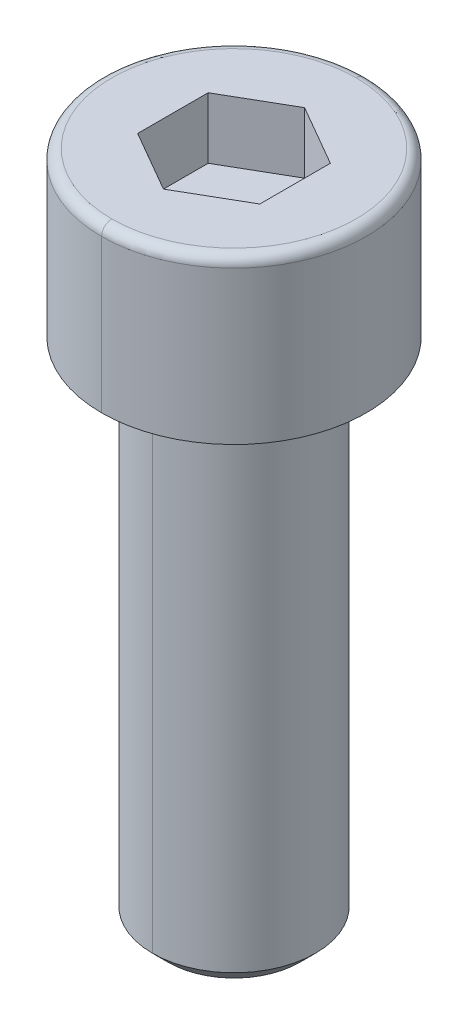
ISO-10303-21;
HEADER;
FILE_DESCRIPTION(('STEP AP214'),'2;1');
FILE_NAME('part.step','',(''),(''),'','','');
FILE_SCHEMA(('AUTOMOTIVE_DESIGN { 1 0 10303 214 1 1 1 1 }'));
ENDSEC;
DATA;
#1=APPLICATION_CONTEXT('core data for automotive mechanical design processes');
#2=APPLICATION_PROTOCOL_DEFINITION('international standard','automotive_design',2000,#1);
#3=PRODUCT_CONTEXT('',#1,'mechanical');
#4=PRODUCT('Part','Part','',(#3));
#5=PRODUCT_RELATED_PRODUCT_CATEGORY('part','',(#4));
#6=PRODUCT_DEFINITION_FORMATION('','',#4);
#7=PRODUCT_DEFINITION_CONTEXT('part definition',#1,'design');
#8=PRODUCT_DEFINITION('design','',#6,#7);
#9=PRODUCT_DEFINITION_SHAPE('','',#8);
#10=(LENGTH_UNIT() NAMED_UNIT(*) SI_UNIT(.MILLI.,.METRE.));
#11=(NAMED_UNIT(*) PLANE_ANGLE_UNIT() SI_UNIT($,.RADIAN.));
#12=(NAMED_UNIT(*) SI_UNIT($,.STERADIAN.) SOLID_ANGLE_UNIT());
#13=UNCERTAINTY_MEASURE_WITH_UNIT(LENGTH_MEASURE(1.E-05),#10,'distance_accuracy_value','');
#14=(GEOMETRIC_REPRESENTATION_CONTEXT(3) GLOBAL_UNCERTAINTY_ASSIGNED_CONTEXT((#13)) GLOBAL_UNIT_ASSIGNED_CONTEXT((#10,
#11,#12)) REPRESENTATION_CONTEXT('',''));
#15=CARTESIAN_POINT('',(0.,0.,0.));
#16=DIRECTION('',(0.,0.,1.));
#17=DIRECTION('',(1.,0.,0.));
#18=AXIS2_PLACEMENT_3D('',#15,#16,#17);
#19=CARTESIAN_POINT('',(0.,8.,0.));
#20=DIRECTION('',(0.,-1.,0.));
#21=DIRECTION('',(0.,0.,-1.));
#22=AXIS2_PLACEMENT_3D('',#19,#20,#21);
#23=PLANE('',#22);
#24=CARTESIAN_POINT('',(0.,8.,0.));
#25=DIRECTION('',(0.,-1.,0.));
#26=DIRECTION('',(0.,0.,-1.));
#27=AXIS2_PLACEMENT_3D('',#24,#25,#26);
#28=CIRCLE('',#27,6.);
#29=CARTESIAN_POINT('',(0.,8.,-6.));
#30=VERTEX_POINT('',#29);
#31=CARTESIAN_POINT('',(0.,8.,6.));
#32=VERTEX_POINT('',#31);
#33=EDGE_CURVE('E11',#30,#32,#28,.T.);
#34=ORIENTED_EDGE('',*,*,#33,.F.);
#35=CARTESIAN_POINT('',(0.,8.,0.));
#36=DIRECTION('',(0.,-1.,0.));
#37=DIRECTION('',(0.,0.,-1.));
#38=AXIS2_PLACEMENT_3D('',#35,#36,#37);
#39=CIRCLE('',#38,6.);
#40=EDGE_CURVE('E25',#32,#30,#39,.T.);
#41=ORIENTED_EDGE('',*,*,#40,.F.);
#42=EDGE_LOOP('',(#34,#41));
#43=FACE_BOUND('',#42,.T.);
#44=DIRECTION('',(0.866025403784436,0.,-0.500000000000005));
#45=VECTOR('',#44,1.);
#46=CARTESIAN_POINT('',(0.,8.,3.4641016151378));
#47=LINE('',#46,#45);
#48=CARTESIAN_POINT('',(0.,8.,3.4641016151378));
#49=VERTEX_POINT('',#48);
#50=CARTESIAN_POINT('',(3.,8.,1.7320508075689));
#51=VERTEX_POINT('',#50);
#52=EDGE_CURVE('E404',#49,#51,#47,.T.);
#53=ORIENTED_EDGE('',*,*,#52,.F.);
#54=DIRECTION('',(0.866025403784436,0.,0.500000000000005));
#55=VECTOR('',#54,1.);
#56=CARTESIAN_POINT('',(-3.,8.,1.7320508075689));
#57=LINE('',#56,#55);
#58=CARTESIAN_POINT('',(-3.,8.,1.7320508075689));
#59=VERTEX_POINT('',#58);
#60=EDGE_CURVE('E399',#59,#49,#57,.T.);
#61=ORIENTED_EDGE('',*,*,#60,.F.);
#62=DIRECTION('',(0.,0.,1.));
#63=VECTOR('',#62,1.);
#64=CARTESIAN_POINT('',(-3.,8.,-1.7320508075689));
#65=LINE('',#64,#63);
#66=CARTESIAN_POINT('',(-3.,8.,-1.7320508075689));
#67=VERTEX_POINT('',#66);
#68=EDGE_CURVE('E394',#67,#59,#65,.T.);
#69=ORIENTED_EDGE('',*,*,#68,.F.);
#70=DIRECTION('',(-0.866025403784436,0.,0.500000000000005));
#71=VECTOR('',#70,1.);
#72=CARTESIAN_POINT('',(0.,8.,-3.4641016151378));
#73=LINE('',#72,#71);
#74=CARTESIAN_POINT('',(0.,8.,-3.4641016151378));
#75=VERTEX_POINT('',#74);
#76=EDGE_CURVE('E389',#75,#67,#73,.T.);
#77=ORIENTED_EDGE('',*,*,#76,.F.);
#78=DIRECTION('',(-0.866025403784436,0.,-0.500000000000005));
#79=VECTOR('',#78,1.);
#80=CARTESIAN_POINT('',(3.,8.,-1.7320508075689));
#81=LINE('',#80,#79);
#82=CARTESIAN_POINT('',(3.,8.,-1.7320508075689));
#83=VERTEX_POINT('',#82);
#84=EDGE_CURVE('E384',#83,#75,#81,.T.);
#85=ORIENTED_EDGE('',*,*,#84,.F.);
#86=DIRECTION('',(0.,0.,1.));
#87=VECTOR('',#86,1.);
#88=CARTESIAN_POINT('',(3.,8.,0.));
#89=LINE('',#88,#87);
#90=EDGE_CURVE('E380',#83,#51,#89,.T.);
#91=ORIENTED_EDGE('',*,*,#90,.T.);
#92=EDGE_LOOP('',(#53,#61,#69,#77,#85,#91));
#93=FACE_BOUND('',#92,.T.);
#94=ADVANCED_FACE('F17',(#43,#93),#23,.F.);
#95=CARTESIAN_POINT('',(3.,5.,1.7320508075689));
#96=DIRECTION('',(1.,0.,0.));
#97=DIRECTION('',(0.,0.,-1.));
#98=AXIS2_PLACEMENT_3D('',#95,#96,#97);
#99=PLANE('',#98);
#100=DIRECTION('',(0.,1.,0.));
#101=VECTOR('',#100,1.);
#102=CARTESIAN_POINT('',(3.,5.,1.7320508075689));
#103=LINE('',#102,#101);
#104=CARTESIAN_POINT('',(3.,5.,1.7320508075689));
#105=VERTEX_POINT('',#104);
#106=EDGE_CURVE('E375',#105,#51,#103,.T.);
#107=ORIENTED_EDGE('',*,*,#106,.T.);
#108=ORIENTED_EDGE('',*,*,#90,.F.);
#109=DIRECTION('',(0.,1.,0.));
#110=VECTOR('',#109,1.);
#111=CARTESIAN_POINT('',(3.,5.,-1.7320508075689));
#112=LINE('',#111,#110);
#113=CARTESIAN_POINT('',(3.,5.,-1.7320508075689));
#114=VERTEX_POINT('',#113);
#115=EDGE_CURVE('E370',#114,#83,#112,.T.);
#116=ORIENTED_EDGE('',*,*,#115,.F.);
#117=DIRECTION('',(0.,0.,-1.));
#118=VECTOR('',#117,1.);
#119=CARTESIAN_POINT('',(3.,5.,1.7320508075689));
#120=LINE('',#119,#118);
#121=EDGE_CURVE('E365',#105,#114,#120,.T.);
#122=ORIENTED_EDGE('',*,*,#121,.F.);
#123=EDGE_LOOP('',(#107,#108,#116,#122));
#124=FACE_BOUND('',#123,.T.);
#125=ADVANCED_FACE('F422',(#124),#99,.F.);
#126=CARTESIAN_POINT('',(0.,5.,0.));
#127=DIRECTION('',(0.,1.,0.));
#128=DIRECTION('',(0.,0.,1.));
#129=AXIS2_PLACEMENT_3D('',#126,#127,#128);
#130=PLANE('',#129);
#131=DIRECTION('',(0.,0.,1.));
#132=VECTOR('',#131,1.);
#133=CARTESIAN_POINT('',(-3.,5.,-1.7320508075689));
#134=LINE('',#133,#132);
#135=CARTESIAN_POINT('',(-3.,5.,-1.7320508075689));
#136=VERTEX_POINT('',#135);
#137=CARTESIAN_POINT('',(-3.,5.,1.7320508075689));
#138=VERTEX_POINT('',#137);
#139=EDGE_CURVE('E361',#136,#138,#134,.T.);
#140=ORIENTED_EDGE('',*,*,#139,.T.);
#141=DIRECTION('',(0.866025403784436,0.,0.500000000000005));
#142=VECTOR('',#141,1.);
#143=CARTESIAN_POINT('',(-3.,5.,1.7320508075689));
#144=LINE('',#143,#142);
#145=CARTESIAN_POINT('',(0.,5.,3.4641016151378));
#146=VERTEX_POINT('',#145);
#147=EDGE_CURVE('E357',#138,#146,#144,.T.);
#148=ORIENTED_EDGE('',*,*,#147,.T.);
#149=DIRECTION('',(0.866025403784436,0.,-0.500000000000005));
#150=VECTOR('',#149,1.);
#151=CARTESIAN_POINT('',(0.,5.,3.4641016151378));
#152=LINE('',#151,#150);
#153=EDGE_CURVE('E352',#146,#105,#152,.T.);
#154=ORIENTED_EDGE('',*,*,#153,.T.);
#155=ORIENTED_EDGE('',*,*,#121,.T.);
#156=DIRECTION('',(-0.866025403784436,0.,-0.500000000000005));
#157=VECTOR('',#156,1.);
#158=CARTESIAN_POINT('',(3.,5.,-1.7320508075689));
#159=LINE('',#158,#157);
#160=CARTESIAN_POINT('',(0.,5.,-3.4641016151378));
#161=VERTEX_POINT('',#160);
#162=EDGE_CURVE('E348',#114,#161,#159,.T.);
#163=ORIENTED_EDGE('',*,*,#162,.T.);
#164=DIRECTION('',(-0.866025403784436,0.,0.500000000000005));
#165=VECTOR('',#164,1.);
#166=CARTESIAN_POINT('',(0.,5.,-3.4641016151378));
#167=LINE('',#166,#165);
#168=EDGE_CURVE('E344',#161,#136,#167,.T.);
#169=ORIENTED_EDGE('',*,*,#168,.T.);
#170=EDGE_LOOP('',(#140,#148,#154,#155,#163,#169));
#171=FACE_BOUND('',#170,.T.);
#172=ADVANCED_FACE('F426',(#171),#130,.T.);
#173=CARTESIAN_POINT('',(0.,5.,-3.4641016151378));
#174=DIRECTION('',(-0.500000000000005,0.,-0.866025403784436));
#175=DIRECTION('',(-0.866025403784436,0.,0.500000000000005));
#176=AXIS2_PLACEMENT_3D('',#173,#174,#175);
#177=PLANE('',#176);
#178=ORIENTED_EDGE('',*,*,#76,.T.);
#179=DIRECTION('',(0.,1.,0.));
#180=VECTOR('',#179,1.);
#181=CARTESIAN_POINT('',(-3.,5.,-1.7320508075689));
#182=LINE('',#181,#180);
#183=EDGE_CURVE('E339',#136,#67,#182,.T.);
#184=ORIENTED_EDGE('',*,*,#183,.F.);
#185=ORIENTED_EDGE('',*,*,#168,.F.);
#186=DIRECTION('',(0.,1.,0.));
#187=VECTOR('',#186,1.);
#188=CARTESIAN_POINT('',(0.,5.,-3.4641016151378));
#189=LINE('',#188,#187);
#190=EDGE_CURVE('E334',#161,#75,#189,.T.);
#191=ORIENTED_EDGE('',*,*,#190,.T.);
#192=EDGE_LOOP('',(#178,#184,#185,#191));
#193=FACE_BOUND('',#192,.T.);
#194=ADVANCED_FACE('F444',(#193),#177,.F.);
#195=CARTESIAN_POINT('',(3.,5.,-1.7320508075689));
#196=DIRECTION('',(0.500000000000005,0.,-0.866025403784436));
#197=DIRECTION('',(-0.866025403784436,0.,-0.500000000000005));
#198=AXIS2_PLACEMENT_3D('',#195,#196,#197);
#199=PLANE('',#198);
#200=ORIENTED_EDGE('',*,*,#84,.T.);
#201=ORIENTED_EDGE('',*,*,#190,.F.);
#202=ORIENTED_EDGE('',*,*,#162,.F.);
#203=ORIENTED_EDGE('',*,*,#115,.T.);
#204=EDGE_LOOP('',(#200,#201,#202,#203));
#205=FACE_BOUND('',#204,.T.);
#206=ADVANCED_FACE('F447',(#205),#199,.F.);
#207=CARTESIAN_POINT('',(-3.,5.,-1.7320508075689));
#208=DIRECTION('',(-1.,0.,0.));
#209=DIRECTION('',(0.,0.,1.));
#210=AXIS2_PLACEMENT_3D('',#207,#208,#209);
#211=PLANE('',#210);
#212=ORIENTED_EDGE('',*,*,#68,.T.);
#213=DIRECTION('',(0.,1.,0.));
#214=VECTOR('',#213,1.);
#215=CARTESIAN_POINT('',(-3.,5.,1.7320508075689));
#216=LINE('',#215,#214);
#217=EDGE_CURVE('E329',#138,#59,#216,.T.);
#218=ORIENTED_EDGE('',*,*,#217,.F.);
#219=ORIENTED_EDGE('',*,*,#139,.F.);
#220=ORIENTED_EDGE('',*,*,#183,.T.);
#221=EDGE_LOOP('',(#212,#218,#219,#220));
#222=FACE_BOUND('',#221,.T.);
#223=ADVANCED_FACE('F442',(#222),#211,.F.);
#224=CARTESIAN_POINT('',(-3.,5.,1.7320508075689));
#225=DIRECTION('',(-0.500000000000005,0.,0.866025403784436));
#226=DIRECTION('',(0.866025403784436,0.,0.500000000000005));
#227=AXIS2_PLACEMENT_3D('',#224,#225,#226);
#228=PLANE('',#227);
#229=ORIENTED_EDGE('',*,*,#60,.T.);
#230=DIRECTION('',(0.,1.,0.));
#231=VECTOR('',#230,1.);
#232=CARTESIAN_POINT('',(0.,5.,3.4641016151378));
#233=LINE('',#232,#231);
#234=EDGE_CURVE('E326',#146,#49,#233,.T.);
#235=ORIENTED_EDGE('',*,*,#234,.F.);
#236=ORIENTED_EDGE('',*,*,#147,.F.);
#237=ORIENTED_EDGE('',*,*,#217,.T.);
#238=EDGE_LOOP('',(#229,#235,#236,#237));
#239=FACE_BOUND('',#238,.T.);
#240=ADVANCED_FACE('F419',(#239),#228,.F.);
#241=CARTESIAN_POINT('',(0.,5.,3.4641016151378));
#242=DIRECTION('',(0.500000000000005,0.,0.866025403784436));
#243=DIRECTION('',(0.866025403784436,0.,-0.500000000000005));
#244=AXIS2_PLACEMENT_3D('',#241,#242,#243);
#245=PLANE('',#244);
#246=ORIENTED_EDGE('',*,*,#52,.T.);
#247=ORIENTED_EDGE('',*,*,#106,.F.);
#248=ORIENTED_EDGE('',*,*,#153,.F.);
#249=ORIENTED_EDGE('',*,*,#234,.T.);
#250=EDGE_LOOP('',(#246,#247,#248,#249));
#251=FACE_BOUND('',#250,.T.);
#252=ADVANCED_FACE('F414',(#251),#245,.F.);
#253=CARTESIAN_POINT('',(0.,7.50000000000009,0.));
#254=DIRECTION('',(0.,-1.,0.));
#255=DIRECTION('',(1.,0.,0.));
#256=AXIS2_PLACEMENT_3D('',#253,#254,#255);
#257=TOROIDAL_SURFACE('',#256,6.00000000000009,0.499999999999912);
#258=ORIENTED_EDGE('',*,*,#40,.T.);
#259=CARTESIAN_POINT('',(0.,8.,-6.));
#260=CARTESIAN_POINT('',(0.,8.00000017354439,-6.00818123913044));
#261=CARTESIAN_POINT('',(0.,7.99979920856258,-6.01636246349396));
#262=CARTESIAN_POINT('',(0.,7.9989962476426,-6.03270521083345));
#263=CARTESIAN_POINT('',(0.,7.99839425170444,-6.04086673380942));
#264=CARTESIAN_POINT('',(0.,7.99679047496778,-6.05715040652013));
#265=CARTESIAN_POINT('',(0.,7.9957886941693,-6.06527255625486));
#266=CARTESIAN_POINT('',(0.,7.99338781579552,-6.08145791820049));
#267=CARTESIAN_POINT('',(0.,7.99198871822022,-6.08952113041138));
#268=CARTESIAN_POINT('',(0.,7.98879656218305,-6.10556919160473));
#269=CARTESIAN_POINT('',(0.,7.98700350372117,-6.1135540405872));
#270=CARTESIAN_POINT('',(0.,7.98302774947342,-6.12942613931605));
#271=CARTESIAN_POINT('',(0.,7.98084505368755,-6.13731338906245));
#272=CARTESIAN_POINT('',(0.,7.97609528204471,-6.152971288192));
#273=CARTESIAN_POINT('',(0.,7.97352820618775,-6.16074193757515));
#274=CARTESIAN_POINT('',(0.,7.96801585899533,-6.17614791581706));
#275=CARTESIAN_POINT('',(0.,7.96507058765986,-6.18378324467582));
#276=CARTESIAN_POINT('',(0.,7.95880894485149,-6.19890018768925));
#277=CARTESIAN_POINT('',(0.,7.95549257337859,-6.20638180184392));
#278=CARTESIAN_POINT('',(0.,7.94849671974494,-6.22117329158634));
#279=CARTESIAN_POINT('',(0.,7.94481723758419,-6.2284831671741));
#280=CARTESIAN_POINT('',(0.,7.93710402676425,-6.24291356965188));
#281=CARTESIAN_POINT('',(0.,7.93307029810505,-6.2500340965419));
#282=CARTESIAN_POINT('',(0.,7.92465831189531,-6.26406864765131));
#283=CARTESIAN_POINT('',(0.,7.92028005434477,-6.2709826718707));
#284=CARTESIAN_POINT('',(0.,7.91118955795787,-6.28458756114889));
#285=CARTESIAN_POINT('',(0.,7.90647731912153,-6.29127842620769));
#286=CARTESIAN_POINT('',(0.,7.89673021235923,-6.30442087828473));
#287=CARTESIAN_POINT('',(0.,7.89169534443327,-6.31087246530297));
#288=CARTESIAN_POINT('',(0.,7.88131510892958,-6.32352081886066));
#289=CARTESIAN_POINT('',(0.,7.87596974135183,-6.32971758540012));
#290=CARTESIAN_POINT('',(0.,7.86498138400325,-6.34184136944688));
#291=CARTESIAN_POINT('',(0.,7.85933839423241,-6.34776838695419));
#292=CARTESIAN_POINT('',(0.,7.84776838695426,-6.35933839423234));
#293=CARTESIAN_POINT('',(0.,7.84184136944696,-6.36498138400318));
#294=CARTESIAN_POINT('',(0.,7.82971758540019,-6.37596974135177));
#295=CARTESIAN_POINT('',(0.,7.82352081886074,-6.38131510892951));
#296=CARTESIAN_POINT('',(0.,7.81087246530304,-6.39169534443321));
#297=CARTESIAN_POINT('',(0.,7.80442087828481,-6.39673021235917));
#298=CARTESIAN_POINT('',(0.,7.79127842620777,-6.40647731912147));
#299=CARTESIAN_POINT('',(0.,7.78458756114897,-6.41118955795782));
#300=CARTESIAN_POINT('',(0.,7.77098267187078,-6.42028005434472));
#301=CARTESIAN_POINT('',(0.,7.76406864765139,-6.42465831189526));
#302=CARTESIAN_POINT('',(0.,7.75003409654198,-6.433070298105));
#303=CARTESIAN_POINT('',(0.,7.74291356965196,-6.4371040267642));
#304=CARTESIAN_POINT('',(0.,7.72848316717419,-6.44481723758415));
#305=CARTESIAN_POINT('',(0.,7.72117329158643,-6.44849671974489));
#306=CARTESIAN_POINT('',(0.,7.70638180184401,-6.45549257337855));
#307=CARTESIAN_POINT('',(0.,7.69890018768934,-6.45880894485145));
#308=CARTESIAN_POINT('',(0.,7.68378324467591,-6.46507058765983));
#309=CARTESIAN_POINT('',(0.,7.67614791581715,-6.46801585899529));
#310=CARTESIAN_POINT('',(0.,7.66074193757524,-6.47352820618772));
#311=CARTESIAN_POINT('',(0.,7.65297128819209,-6.47609528204469));
#312=CARTESIAN_POINT('',(0.,7.63731338906254,-6.48084505368752));
#313=CARTESIAN_POINT('',(0.,7.62942613931615,-6.4830277494734));
#314=CARTESIAN_POINT('',(0.,7.61355404058729,-6.48700350372115));
#315=CARTESIAN_POINT('',(0.,7.60556919160483,-6.48879656218303));
#316=CARTESIAN_POINT('',(0.,7.58952113041147,-6.4919887182202));
#317=CARTESIAN_POINT('',(0.,7.58145791820058,-6.4933878157955));
#318=CARTESIAN_POINT('',(0.,7.56527255625496,-6.49578869416928));
#319=CARTESIAN_POINT('',(0.,7.55715040652022,-6.49679047496777));
#320=CARTESIAN_POINT('',(0.,7.54086673380952,-6.49839425170443));
#321=CARTESIAN_POINT('',(0.,7.53270521083355,-6.4989962476426));
#322=CARTESIAN_POINT('',(0.,7.51636246349406,-6.49979920856258));
#323=CARTESIAN_POINT('',(0.,7.50818123913054,-6.50000017354439));
#324=CARTESIAN_POINT('',(0.,7.50000000000009,-6.5));
#325=B_SPLINE_CURVE_WITH_KNOTS('',3,(#259,#260,#261,#262,#263,#264,#265,#266,#267,#268,#269,
#270,#271,#272,#273,#274,#275,#276,#277,#278,#279,#280,#281,#282,#283,#284,#285,#286,#287,#288,
#289,#290,#291,#292,#293,#294,#295,#296,#297,#298,#299,#300,#301,#302,#303,#304,#305,#306,#307,
#308,#309,#310,#311,#312,#313,#314,#315,#316,#317,#318,#319,#320,#321,#322,#323,#324),
.UNSPECIFIED.,.F.,.F.,(4,2,2,2,2,2,2,2,2,2,2,2,2,2,2,2,2,2,2,2,2,2,2,2,2,2,2,2,2,2,2,2,4),(0.,
0.0245412285229107,0.0490824570458209,0.0736236855687315,0.0981649140916426,0.122706142614553,
0.147247371137464,0.171788599660375,0.196329828183285,0.220871056706196,0.245412285229107,
0.269953513752018,0.294494742274929,0.319035970797839,0.343577199320751,0.36811842784366,
0.392659656366572,0.417200884889482,0.441742113412393,0.466283341935303,0.490824570458214,
0.515365798981125,0.539907027504036,0.564448256026947,0.588989484549857,0.613530713072768,
0.638071941595679,0.662613170118589,0.687154398641501,0.711695627164411,0.736236855687322,
0.760778084210233,0.785319312733143),.UNSPECIFIED.);
#326=CARTESIAN_POINT('',(0.,7.50000000000009,-6.5));
#327=VERTEX_POINT('',#326);
#328=EDGE_CURVE('E298',#30,#327,#325,.T.);
#329=ORIENTED_EDGE('',*,*,#328,.T.);
#330=CARTESIAN_POINT('',(0.,7.50000000000009,0.));
#331=DIRECTION('',(0.,-1.,0.));
#332=DIRECTION('',(0.,0.,-1.));
#333=AXIS2_PLACEMENT_3D('',#330,#331,#332);
#334=CIRCLE('',#333,6.5);
#335=CARTESIAN_POINT('',(0.,7.50000000000009,6.5));
#336=VERTEX_POINT('',#335);
#337=EDGE_CURVE('E313',#336,#327,#334,.T.);
#338=ORIENTED_EDGE('',*,*,#337,.F.);
#339=CARTESIAN_POINT('',(0.,8.,6.));
#340=CARTESIAN_POINT('',(0.,8.00000017354439,6.00818123913044));
#341=CARTESIAN_POINT('',(0.,7.99979920856258,6.01636246349396));
#342=CARTESIAN_POINT('',(0.,7.9989962476426,6.03270521083345));
#343=CARTESIAN_POINT('',(0.,7.99839425170444,6.04086673380942));
#344=CARTESIAN_POINT('',(0.,7.99679047496778,6.05715040652013));
#345=CARTESIAN_POINT('',(0.,7.9957886941693,6.06527255625486));
#346=CARTESIAN_POINT('',(0.,7.99338781579552,6.08145791820049));
#347=CARTESIAN_POINT('',(0.,7.99198871822022,6.08952113041138));
#348=CARTESIAN_POINT('',(0.,7.98879656218305,6.10556919160474));
#349=CARTESIAN_POINT('',(0.,7.98700350372117,6.1135540405872));
#350=CARTESIAN_POINT('',(0.,7.98302774947342,6.12942613931605));
#351=CARTESIAN_POINT('',(0.,7.98084505368755,6.13731338906245));
#352=CARTESIAN_POINT('',(0.,7.97609528204472,6.152971288192));
#353=CARTESIAN_POINT('',(0.,7.97352820618775,6.16074193757515));
#354=CARTESIAN_POINT('',(0.,7.96801585899533,6.17614791581706));
#355=CARTESIAN_POINT('',(0.,7.96507058765986,6.18378324467582));
#356=CARTESIAN_POINT('',(0.,7.95880894485149,6.19890018768925));
#357=CARTESIAN_POINT('',(0.,7.95549257337859,6.20638180184392));
#358=CARTESIAN_POINT('',(0.,7.94849671974493,6.22117329158635));
#359=CARTESIAN_POINT('',(0.,7.94481723758419,6.2284831671741));
#360=CARTESIAN_POINT('',(0.,7.93710402676425,6.24291356965188));
#361=CARTESIAN_POINT('',(0.,7.93307029810505,6.2500340965419));
#362=CARTESIAN_POINT('',(0.,7.92465831189531,6.26406864765131));
#363=CARTESIAN_POINT('',(0.,7.92028005434477,6.2709826718707));
#364=CARTESIAN_POINT('',(0.,7.91118955795787,6.28458756114889));
#365=CARTESIAN_POINT('',(0.,7.90647731912152,6.29127842620769));
#366=CARTESIAN_POINT('',(0.,7.89673021235922,6.30442087828473));
#367=CARTESIAN_POINT('',(0.,7.89169534443327,6.31087246530297));
#368=CARTESIAN_POINT('',(0.,7.88131510892958,6.32352081886066));
#369=CARTESIAN_POINT('',(0.,7.87596974135183,6.32971758540012));
#370=CARTESIAN_POINT('',(0.,7.86498138400324,6.34184136944689));
#371=CARTESIAN_POINT('',(0.,7.85933839423241,6.34776838695419));
#372=CARTESIAN_POINT('',(0.,7.84776838695426,6.35933839423234));
#373=CARTESIAN_POINT('',(0.,7.84184136944695,6.36498138400318));
#374=CARTESIAN_POINT('',(0.,7.82971758540019,6.37596974135177));
#375=CARTESIAN_POINT('',(0.,7.82352081886074,6.38131510892951));
#376=CARTESIAN_POINT('',(0.,7.81087246530304,6.39169534443321));
#377=CARTESIAN_POINT('',(0.,7.8044208782848,6.39673021235917));
#378=CARTESIAN_POINT('',(0.,7.79127842620777,6.40647731912147));
#379=CARTESIAN_POINT('',(0.,7.78458756114897,6.41118955795782));
#380=CARTESIAN_POINT('',(0.,7.77098267187078,6.42028005434472));
#381=CARTESIAN_POINT('',(0.,7.76406864765139,6.42465831189526));
#382=CARTESIAN_POINT('',(0.,7.75003409654198,6.433070298105));
#383=CARTESIAN_POINT('',(0.,7.74291356965196,6.4371040267642));
#384=CARTESIAN_POINT('',(0.,7.72848316717419,6.44481723758415));
#385=CARTESIAN_POINT('',(0.,7.72117329158643,6.44849671974489));
#386=CARTESIAN_POINT('',(0.,7.70638180184401,6.45549257337855));
#387=CARTESIAN_POINT('',(0.,7.69890018768934,6.45880894485146));
#388=CARTESIAN_POINT('',(0.,7.68378324467591,6.46507058765983));
#389=CARTESIAN_POINT('',(0.,7.67614791581715,6.4680158589953));
#390=CARTESIAN_POINT('',(0.,7.66074193757524,6.47352820618772));
#391=CARTESIAN_POINT('',(0.,7.65297128819209,6.47609528204469));
#392=CARTESIAN_POINT('',(0.,7.63731338906254,6.48084505368752));
#393=CARTESIAN_POINT('',(0.,7.62942613931614,6.4830277494734));
#394=CARTESIAN_POINT('',(0.,7.61355404058729,6.48700350372115));
#395=CARTESIAN_POINT('',(0.,7.60556919160483,6.48879656218303));
#396=CARTESIAN_POINT('',(0.,7.58952113041147,6.4919887182202));
#397=CARTESIAN_POINT('',(0.,7.58145791820058,6.4933878157955));
#398=CARTESIAN_POINT('',(0.,7.56527255625496,6.49578869416928));
#399=CARTESIAN_POINT('',(0.,7.55715040652022,6.49679047496777));
#400=CARTESIAN_POINT('',(0.,7.54086673380952,6.49839425170443));
#401=CARTESIAN_POINT('',(0.,7.53270521083355,6.4989962476426));
#402=CARTESIAN_POINT('',(0.,7.51636246349406,6.49979920856258));
#403=CARTESIAN_POINT('',(0.,7.50818123913054,6.50000017354439));
#404=CARTESIAN_POINT('',(0.,7.50000000000009,6.5));
#405=B_SPLINE_CURVE_WITH_KNOTS('',3,(#339,#340,#341,#342,#343,#344,#345,#346,#347,#348,#349,
#350,#351,#352,#353,#354,#355,#356,#357,#358,#359,#360,#361,#362,#363,#364,#365,#366,#367,#368,
#369,#370,#371,#372,#373,#374,#375,#376,#377,#378,#379,#380,#381,#382,#383,#384,#385,#386,#387,
#388,#389,#390,#391,#392,#393,#394,#395,#396,#397,#398,#399,#400,#401,#402,#403,#404),
.UNSPECIFIED.,.F.,.F.,(4,2,2,2,2,2,2,2,2,2,2,2,2,2,2,2,2,2,2,2,2,2,2,2,2,2,2,2,2,2,2,2,4),(0.,
0.0245412285229107,0.0490824570458209,0.0736236855687315,0.0981649140916429,0.122706142614553,
0.147247371137464,0.171788599660375,0.196329828183285,0.220871056706196,0.245412285229107,
0.269953513752017,0.294494742274928,0.319035970797839,0.343577199320749,0.368118427843661,
0.392659656366571,0.417200884889482,0.441742113412393,0.466283341935304,0.490824570458214,
0.515365798981125,0.539907027504035,0.564448256026946,0.588989484549857,0.613530713072768,
0.638071941595678,0.662613170118589,0.6871543986415,0.711695627164411,0.736236855687321,
0.760778084210232,0.785319312733142),.UNSPECIFIED.);
#406=EDGE_CURVE('E300',#32,#336,#405,.T.);
#407=ORIENTED_EDGE('',*,*,#406,.F.);
#408=EDGE_LOOP('',(#258,#329,#338,#407));
#409=FACE_BOUND('',#408,.T.);
#410=ADVANCED_FACE('F282',(#409),#257,.T.);
#411=CARTESIAN_POINT('',(0.,7.50000000000009,0.));
#412=DIRECTION('',(0.,-1.,0.));
#413=DIRECTION('',(-1.,0.,0.));
#414=AXIS2_PLACEMENT_3D('',#411,#412,#413);
#415=TOROIDAL_SURFACE('',#414,6.00000000000009,0.499999999999912);
#416=CARTESIAN_POINT('',(0.,7.50000000000009,0.));
#417=DIRECTION('',(0.,-1.,0.));
#418=DIRECTION('',(0.,0.,-1.));
#419=AXIS2_PLACEMENT_3D('',#416,#417,#418);
#420=CIRCLE('',#419,6.5);
#421=EDGE_CURVE('E265',#327,#336,#420,.T.);
#422=ORIENTED_EDGE('',*,*,#421,.F.);
#423=ORIENTED_EDGE('',*,*,#328,.F.);
#424=ORIENTED_EDGE('',*,*,#33,.T.);
#425=ORIENTED_EDGE('',*,*,#406,.T.);
#426=EDGE_LOOP('',(#422,#423,#424,#425));
#427=FACE_BOUND('',#426,.T.);
#428=ADVANCED_FACE('F273',(#427),#415,.T.);
#429=CARTESIAN_POINT('',(0.,0.,0.));
#430=DIRECTION('',(0.,1.,0.));
#431=DIRECTION('',(-1.,0.,0.));
#432=AXIS2_PLACEMENT_3D('',#429,#430,#431);
#433=CYLINDRICAL_SURFACE('',#432,6.5);
#434=CARTESIAN_POINT('',(0.,0.,0.));
#435=DIRECTION('',(0.,-1.,0.));
#436=DIRECTION('',(0.,0.,-1.));
#437=AXIS2_PLACEMENT_3D('',#434,#435,#436);
#438=CIRCLE('',#437,6.5);
#439=CARTESIAN_POINT('',(0.,0.,-6.5));
#440=VERTEX_POINT('',#439);
#441=CARTESIAN_POINT('',(0.,0.,6.5));
#442=VERTEX_POINT('',#441);
#443=EDGE_CURVE('E262',#440,#442,#438,.T.);
#444=ORIENTED_EDGE('',*,*,#443,.F.);
#445=CARTESIAN_POINT('',(0.,0.,-6.5));
#446=DIRECTION('',(0.,1.,0.));
#447=VECTOR('',#446,1.);
#448=LINE('',#445,#447);
#449=EDGE_CURVE('E239',#440,#327,#448,.T.);
#450=ORIENTED_EDGE('',*,*,#449,.T.);
#451=ORIENTED_EDGE('',*,*,#421,.T.);
#452=CARTESIAN_POINT('',(0.,0.,6.5));
#453=DIRECTION('',(0.,1.,0.));
#454=VECTOR('',#453,1.);
#455=LINE('',#452,#454);
#456=EDGE_CURVE('E252',#442,#336,#455,.T.);
#457=ORIENTED_EDGE('',*,*,#456,.F.);
#458=EDGE_LOOP('',(#444,#450,#451,#457));
#459=FACE_BOUND('',#458,.T.);
#460=ADVANCED_FACE('F218',(#459),#433,.T.);
#461=CARTESIAN_POINT('',(0.,0.,0.));
#462=DIRECTION('',(0.,1.,0.));
#463=DIRECTION('',(1.,0.,0.));
#464=AXIS2_PLACEMENT_3D('',#461,#462,#463);
#465=CYLINDRICAL_SURFACE('',#464,6.5);
#466=ORIENTED_EDGE('',*,*,#337,.T.);
#467=ORIENTED_EDGE('',*,*,#449,.F.);
#468=CARTESIAN_POINT('',(0.,0.,0.));
#469=DIRECTION('',(0.,-1.,0.));
#470=DIRECTION('',(0.,0.,-1.));
#471=AXIS2_PLACEMENT_3D('',#468,#469,#470);
#472=CIRCLE('',#471,6.5);
#473=EDGE_CURVE('E199',#442,#440,#472,.T.);
#474=ORIENTED_EDGE('',*,*,#473,.F.);
#475=ORIENTED_EDGE('',*,*,#456,.T.);
#476=EDGE_LOOP('',(#466,#467,#474,#475));
#477=FACE_BOUND('',#476,.T.);
#478=ADVANCED_FACE('F208',(#477),#465,.T.);
#479=CARTESIAN_POINT('',(6.5,0.,0.));
#480=DIRECTION('',(0.,1.,0.));
#481=DIRECTION('',(0.,0.,1.));
#482=AXIS2_PLACEMENT_3D('',#479,#480,#481);
#483=PLANE('',#482);
#484=CARTESIAN_POINT('',(0.,0.,0.));
#485=DIRECTION('',(0.,-1.,0.));
#486=DIRECTION('',(0.,0.,-1.));
#487=AXIS2_PLACEMENT_3D('',#484,#485,#486);
#488=CIRCLE('',#487,4.);
#489=CARTESIAN_POINT('',(0.,0.,-4.));
#490=VERTEX_POINT('',#489);
#491=CARTESIAN_POINT('',(0.,0.,4.));
#492=VERTEX_POINT('',#491);
#493=EDGE_CURVE('E195',#490,#492,#488,.T.);
#494=ORIENTED_EDGE('',*,*,#493,.F.);
#495=CARTESIAN_POINT('',(0.,0.,0.));
#496=DIRECTION('',(0.,-1.,0.));
#497=DIRECTION('',(0.,0.,-1.));
#498=AXIS2_PLACEMENT_3D('',#495,#496,#497);
#499=CIRCLE('',#498,4.);
#500=EDGE_CURVE('E193',#492,#490,#499,.T.);
#501=ORIENTED_EDGE('',*,*,#500,.F.);
#502=EDGE_LOOP('',(#494,#501));
#503=FACE_BOUND('',#502,.T.);
#504=ORIENTED_EDGE('',*,*,#443,.T.);
#505=ORIENTED_EDGE('',*,*,#473,.T.);
#506=EDGE_LOOP('',(#504,#505));
#507=FACE_BOUND('',#506,.T.);
#508=ADVANCED_FACE('F217',(#503,#507),#483,.F.);
#509=CARTESIAN_POINT('',(0.,-25.,0.));
#510=DIRECTION('',(0.,1.,0.));
#511=DIRECTION('',(1.,0.,0.));
#512=AXIS2_PLACEMENT_3D('',#509,#510,#511);
#513=CYLINDRICAL_SURFACE('',#512,4.);
#514=ORIENTED_EDGE('',*,*,#500,.T.);
#515=CARTESIAN_POINT('',(0.,-24.233,-4.));
#516=DIRECTION('',(0.,1.,0.));
#517=VECTOR('',#516,1.);
#518=LINE('',#515,#517);
#519=CARTESIAN_POINT('',(0.,-24.233,-4.));
#520=VERTEX_POINT('',#519);
#521=EDGE_CURVE('E164',#520,#490,#518,.T.);
#522=ORIENTED_EDGE('',*,*,#521,.F.);
#523=CARTESIAN_POINT('',(0.,-24.233,0.));
#524=DIRECTION('',(0.,-1.,0.));
#525=DIRECTION('',(0.,0.,-1.));
#526=AXIS2_PLACEMENT_3D('',#523,#524,#525);
#527=CIRCLE('',#526,4.);
#528=CARTESIAN_POINT('',(0.,-24.233,4.));
#529=VERTEX_POINT('',#528);
#530=EDGE_CURVE('E180',#529,#520,#527,.T.);
#531=ORIENTED_EDGE('',*,*,#530,.F.);
#532=CARTESIAN_POINT('',(0.,-24.233,4.));
#533=DIRECTION('',(0.,1.,0.));
#534=VECTOR('',#533,1.);
#535=LINE('',#532,#534);
#536=EDGE_CURVE('E125',#529,#492,#535,.T.);
#537=ORIENTED_EDGE('',*,*,#536,.T.);
#538=EDGE_LOOP('',(#514,#522,#531,#537));
#539=FACE_BOUND('',#538,.T.);
#540=ADVANCED_FACE('F147',(#539),#513,.T.);
#541=CARTESIAN_POINT('',(0.,-25.,0.));
#542=DIRECTION('',(0.,1.,0.));
#543=DIRECTION('',(-1.,0.,0.));
#544=AXIS2_PLACEMENT_3D('',#541,#542,#543);
#545=CYLINDRICAL_SURFACE('',#544,4.);
#546=CARTESIAN_POINT('',(0.,-24.233,0.));
#547=DIRECTION('',(0.,-1.,0.));
#548=DIRECTION('',(0.,0.,-1.));
#549=AXIS2_PLACEMENT_3D('',#546,#547,#548);
#550=CIRCLE('',#549,4.);
#551=EDGE_CURVE('E110',#520,#529,#550,.T.);
#552=ORIENTED_EDGE('',*,*,#551,.F.);
#553=ORIENTED_EDGE('',*,*,#521,.T.);
#554=ORIENTED_EDGE('',*,*,#493,.T.);
#555=ORIENTED_EDGE('',*,*,#536,.F.);
#556=EDGE_LOOP('',(#552,#553,#554,#555));
#557=FACE_BOUND('',#556,.T.);
#558=ADVANCED_FACE('F137',(#557),#545,.T.);
#559=CARTESIAN_POINT('',(0.,-24.233,0.));
#560=DIRECTION('',(0.,1.,0.));
#561=DIRECTION('',(-1.,0.,0.));
#562=AXIS2_PLACEMENT_3D('',#559,#560,#561);
#563=CONICAL_SURFACE('',#562,4.,0.785398163397448);
#564=CARTESIAN_POINT('',(0.,-25.,0.));
#565=DIRECTION('',(0.,-1.,0.));
#566=DIRECTION('',(0.,0.,-1.));
#567=AXIS2_PLACEMENT_3D('',#564,#565,#566);
#568=CIRCLE('',#567,3.233);
#569=CARTESIAN_POINT('',(0.,-25.,-3.233));
#570=VERTEX_POINT('',#569);
#571=CARTESIAN_POINT('',(0.,-25.,3.233));
#572=VERTEX_POINT('',#571);
#573=EDGE_CURVE('E107',#570,#572,#568,.T.);
#574=ORIENTED_EDGE('',*,*,#573,.F.);
#575=CARTESIAN_POINT('',(0.,-25.,-3.233));
#576=DIRECTION('',(0.,0.707106781186548,-0.707106781186547));
#577=VECTOR('',#576,1.);
#578=LINE('',#575,#577);
#579=EDGE_CURVE('E114',#570,#520,#578,.T.);
#580=ORIENTED_EDGE('',*,*,#579,.T.);
#581=ORIENTED_EDGE('',*,*,#551,.T.);
#582=CARTESIAN_POINT('',(0.,-25.,3.233));
#583=DIRECTION('',(0.,0.707106781186548,0.707106781186547));
#584=VECTOR('',#583,1.);
#585=LINE('',#582,#584);
#586=EDGE_CURVE('E101',#572,#529,#585,.T.);
#587=ORIENTED_EDGE('',*,*,#586,.F.);
#588=EDGE_LOOP('',(#574,#580,#581,#587));
#589=FACE_BOUND('',#588,.T.);
#590=ADVANCED_FACE('F104',(#589),#563,.T.);
#591=CARTESIAN_POINT('',(0.,-24.233,0.));
#592=DIRECTION('',(0.,1.,0.));
#593=DIRECTION('',(1.,0.,0.));
#594=AXIS2_PLACEMENT_3D('',#591,#592,#593);
#595=CONICAL_SURFACE('',#594,4.,0.785398163397448);
#596=ORIENTED_EDGE('',*,*,#530,.T.);
#597=ORIENTED_EDGE('',*,*,#579,.F.);
#598=CARTESIAN_POINT('',(0.,-25.,0.));
#599=DIRECTION('',(0.,-1.,0.));
#600=DIRECTION('',(0.,0.,-1.));
#601=AXIS2_PLACEMENT_3D('',#598,#599,#600);
#602=CIRCLE('',#601,3.233);
#603=EDGE_CURVE('E115',#572,#570,#602,.T.);
#604=ORIENTED_EDGE('',*,*,#603,.F.);
#605=ORIENTED_EDGE('',*,*,#586,.T.);
#606=EDGE_LOOP('',(#596,#597,#604,#605));
#607=FACE_BOUND('',#606,.T.);
#608=ADVANCED_FACE('F119',(#607),#595,.T.);
#609=CARTESIAN_POINT('',(3.233,-25.,0.));
#610=DIRECTION('',(0.,1.,0.));
#611=DIRECTION('',(0.,0.,1.));
#612=AXIS2_PLACEMENT_3D('',#609,#610,#611);
#613=PLANE('',#612);
#614=ORIENTED_EDGE('',*,*,#573,.T.);
#615=ORIENTED_EDGE('',*,*,#603,.T.);
#616=EDGE_LOOP('',(#614,#615));
#617=FACE_BOUND('',#616,.T.);
#618=ADVANCED_FACE('F123',(#617),#613,.F.);
#619=CLOSED_SHELL('',(#94,#125,#172,#194,#206,#223,#240,#252,#410,#428,#460,#478,#508,#540,#558,
#590,#608,#618));
#620=MANIFOLD_SOLID_BREP('B1',#619);
#621=ADVANCED_BREP_SHAPE_REPRESENTATION('',(#18,#620),#14);
#622=SHAPE_DEFINITION_REPRESENTATION(#9,#621);
ENDSEC;
END-ISO-10303-21;
